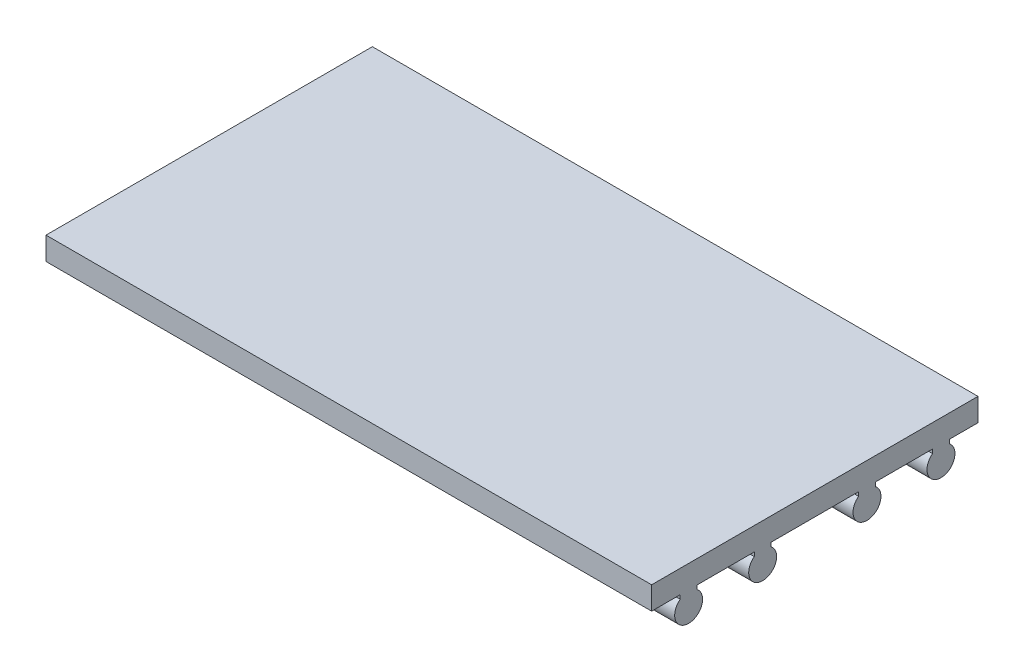
ISO-10303-21;
HEADER;
FILE_DESCRIPTION(('STEP AP214'),'2;1');
FILE_NAME('part.step','',(''),(''),'','','');
FILE_SCHEMA(('AUTOMOTIVE_DESIGN { 1 0 10303 214 1 1 1 1 }'));
ENDSEC;
DATA;
#1=APPLICATION_CONTEXT('core data for automotive mechanical design processes');
#2=APPLICATION_PROTOCOL_DEFINITION('international standard','automotive_design',2000,#1);
#3=PRODUCT_CONTEXT('',#1,'mechanical');
#4=PRODUCT('Part','Part','',(#3));
#5=PRODUCT_RELATED_PRODUCT_CATEGORY('part','',(#4));
#6=PRODUCT_DEFINITION_FORMATION('','',#4);
#7=PRODUCT_DEFINITION_CONTEXT('part definition',#1,'design');
#8=PRODUCT_DEFINITION('design','',#6,#7);
#9=PRODUCT_DEFINITION_SHAPE('','',#8);
#10=(LENGTH_UNIT() NAMED_UNIT(*) SI_UNIT(.MILLI.,.METRE.));
#11=(NAMED_UNIT(*) PLANE_ANGLE_UNIT() SI_UNIT($,.RADIAN.));
#12=(NAMED_UNIT(*) SI_UNIT($,.STERADIAN.) SOLID_ANGLE_UNIT());
#13=UNCERTAINTY_MEASURE_WITH_UNIT(LENGTH_MEASURE(1.E-05),#10,'distance_accuracy_value','');
#14=(GEOMETRIC_REPRESENTATION_CONTEXT(3) GLOBAL_UNCERTAINTY_ASSIGNED_CONTEXT((#13)) GLOBAL_UNIT_ASSIGNED_CONTEXT((#10,
#11,#12)) REPRESENTATION_CONTEXT('',''));
#15=CARTESIAN_POINT('',(0.,0.,0.));
#16=DIRECTION('',(0.,0.,1.));
#17=DIRECTION('',(1.,0.,0.));
#18=AXIS2_PLACEMENT_3D('',#15,#16,#17);
#19=CARTESIAN_POINT('',(90.,224.250000000007,-5.50000000000004));
#20=DIRECTION('',(1.,0.,0.));
#21=DIRECTION('',(0.,0.,-1.));
#22=AXIS2_PLACEMENT_3D('',#19,#20,#21);
#23=PLANE('',#22);
#24=DIRECTION('',(0.,1.,0.));
#25=VECTOR('',#24,1.);
#26=CARTESIAN_POINT('',(90.,226.5,-11.));
#27=LINE('',#26,#25);
#28=CARTESIAN_POINT('',(90.,226.5,-11.));
#29=VERTEX_POINT('',#28);
#30=CARTESIAN_POINT('',(90.,229.900000000001,-11.));
#31=VERTEX_POINT('',#30);
#32=EDGE_CURVE('E317',#29,#31,#27,.T.);
#33=ORIENTED_EDGE('',*,*,#32,.T.);
#34=DIRECTION('',(0.,0.,-1.));
#35=VECTOR('',#34,1.);
#36=CARTESIAN_POINT('',(90.,229.900000000001,37.4999999999997));
#37=LINE('',#36,#35);
#38=CARTESIAN_POINT('',(90.,229.900000000001,37.4999999999997));
#39=VERTEX_POINT('',#38);
#40=EDGE_CURVE('E306',#39,#31,#37,.T.);
#41=ORIENTED_EDGE('',*,*,#40,.F.);
#42=DIRECTION('',(0.,-1.,0.));
#43=VECTOR('',#42,1.);
#44=CARTESIAN_POINT('',(90.,230.750000000007,37.4999999999997));
#45=LINE('',#44,#43);
#46=CARTESIAN_POINT('',(90.,226.500000000007,37.4999999999997));
#47=VERTEX_POINT('',#46);
#48=EDGE_CURVE('E199',#39,#47,#45,.T.);
#49=ORIENTED_EDGE('',*,*,#48,.T.);
#50=DIRECTION('',(0.,0.,-1.));
#51=VECTOR('',#50,1.);
#52=CARTESIAN_POINT('',(90.,226.500000000007,37.4999999999997));
#53=LINE('',#52,#51);
#54=CARTESIAN_POINT('',(90.,226.500000000007,33.2499999999997));
#55=VERTEX_POINT('',#54);
#56=EDGE_CURVE('E201',#47,#55,#53,.T.);
#57=ORIENTED_EDGE('',*,*,#56,.T.);
#58=DIRECTION('',(0.,-1.,0.));
#59=VECTOR('',#58,1.);
#60=CARTESIAN_POINT('',(90.,226.500000000007,33.2499999999997));
#61=LINE('',#60,#59);
#62=CARTESIAN_POINT('',(90.,225.906238207512,33.2499999999997));
#63=VERTEX_POINT('',#62);
#64=EDGE_CURVE('E204',#55,#63,#61,.T.);
#65=ORIENTED_EDGE('',*,*,#64,.T.);
#66=CARTESIAN_POINT('',(90.,224.250000000007,31.9999999999999));
#67=DIRECTION('',(1.,0.,0.));
#68=DIRECTION('',(0.,0.,-1.));
#69=AXIS2_PLACEMENT_3D('',#66,#67,#68);
#70=CIRCLE('',#69,2.07499999999999);
#71=CARTESIAN_POINT('',(90.,225.906238207512,30.7500000000001));
#72=VERTEX_POINT('',#71);
#73=EDGE_CURVE('E207',#63,#72,#70,.T.);
#74=ORIENTED_EDGE('',*,*,#73,.T.);
#75=DIRECTION('',(0.,1.,0.));
#76=VECTOR('',#75,1.);
#77=CARTESIAN_POINT('',(90.,225.906238207512,30.7500000000001));
#78=LINE('',#77,#76);
#79=CARTESIAN_POINT('',(90.,226.500000000007,30.7500000000001));
#80=VERTEX_POINT('',#79);
#81=EDGE_CURVE('E210',#72,#80,#78,.T.);
#82=ORIENTED_EDGE('',*,*,#81,.T.);
#83=DIRECTION('',(0.,0.,-1.));
#84=VECTOR('',#83,1.);
#85=CARTESIAN_POINT('',(90.,226.500000000007,30.7500000000001));
#86=LINE('',#85,#84);
#87=CARTESIAN_POINT('',(90.,226.500000000007,22.2499999999997));
#88=VERTEX_POINT('',#87);
#89=EDGE_CURVE('E213',#80,#88,#86,.T.);
#90=ORIENTED_EDGE('',*,*,#89,.T.);
#91=DIRECTION('',(0.,-1.,0.));
#92=VECTOR('',#91,1.);
#93=CARTESIAN_POINT('',(90.,226.500000000007,22.2499999999997));
#94=LINE('',#93,#92);
#95=CARTESIAN_POINT('',(90.,225.906238207512,22.2499999999997));
#96=VERTEX_POINT('',#95);
#97=EDGE_CURVE('E216',#88,#96,#94,.T.);
#98=ORIENTED_EDGE('',*,*,#97,.T.);
#99=CARTESIAN_POINT('',(90.,224.250000000007,20.9999999999999));
#100=DIRECTION('',(1.,0.,0.));
#101=DIRECTION('',(0.,0.,-1.));
#102=AXIS2_PLACEMENT_3D('',#99,#100,#101);
#103=CIRCLE('',#102,2.07499999999999);
#104=CARTESIAN_POINT('',(90.,225.906238207512,19.7500000000001));
#105=VERTEX_POINT('',#104);
#106=EDGE_CURVE('E219',#96,#105,#103,.T.);
#107=ORIENTED_EDGE('',*,*,#106,.T.);
#108=DIRECTION('',(0.,1.,0.));
#109=VECTOR('',#108,1.);
#110=CARTESIAN_POINT('',(90.,225.906238207512,19.7500000000001));
#111=LINE('',#110,#109);
#112=CARTESIAN_POINT('',(90.,226.500000000007,19.7500000000001));
#113=VERTEX_POINT('',#112);
#114=EDGE_CURVE('E222',#105,#113,#111,.T.);
#115=ORIENTED_EDGE('',*,*,#114,.T.);
#116=DIRECTION('',(0.,0.,-1.));
#117=VECTOR('',#116,1.);
#118=CARTESIAN_POINT('',(90.,226.500000000007,19.7500000000001));
#119=LINE('',#118,#117);
#120=CARTESIAN_POINT('',(90.,226.500000000007,6.75));
#121=VERTEX_POINT('',#120);
#122=EDGE_CURVE('E225',#113,#121,#119,.T.);
#123=ORIENTED_EDGE('',*,*,#122,.T.);
#124=DIRECTION('',(0.,-1.,0.));
#125=VECTOR('',#124,1.);
#126=CARTESIAN_POINT('',(90.,226.500000000007,6.75));
#127=LINE('',#126,#125);
#128=CARTESIAN_POINT('',(90.,225.906238207512,6.75));
#129=VERTEX_POINT('',#128);
#130=EDGE_CURVE('E228',#121,#129,#127,.T.);
#131=ORIENTED_EDGE('',*,*,#130,.T.);
#132=CARTESIAN_POINT('',(90.,224.250000000007,5.49999999999995));
#133=DIRECTION('',(1.,0.,0.));
#134=DIRECTION('',(0.,0.,-1.));
#135=AXIS2_PLACEMENT_3D('',#132,#133,#134);
#136=CIRCLE('',#135,2.075);
#137=CARTESIAN_POINT('',(90.,225.906238207512,4.24999999999991));
#138=VERTEX_POINT('',#137);
#139=EDGE_CURVE('E231',#129,#138,#136,.T.);
#140=ORIENTED_EDGE('',*,*,#139,.T.);
#141=DIRECTION('',(0.,1.,0.));
#142=VECTOR('',#141,1.);
#143=CARTESIAN_POINT('',(90.,225.906238207512,4.24999999999991));
#144=LINE('',#143,#142);
#145=CARTESIAN_POINT('',(90.,226.500000000007,4.24999999999991));
#146=VERTEX_POINT('',#145);
#147=EDGE_CURVE('E234',#138,#146,#144,.T.);
#148=ORIENTED_EDGE('',*,*,#147,.T.);
#149=DIRECTION('',(0.,0.,-1.));
#150=VECTOR('',#149,1.);
#151=CARTESIAN_POINT('',(90.,226.500000000007,4.24999999999991));
#152=LINE('',#151,#150);
#153=CARTESIAN_POINT('',(90.,226.500000000007,-4.24999999999999));
#154=VERTEX_POINT('',#153);
#155=EDGE_CURVE('E167',#146,#154,#152,.T.);
#156=ORIENTED_EDGE('',*,*,#155,.T.);
#157=DIRECTION('',(0.,-1.,0.));
#158=VECTOR('',#157,1.);
#159=CARTESIAN_POINT('',(90.,226.500000000007,-4.24999999999999));
#160=LINE('',#159,#158);
#161=CARTESIAN_POINT('',(90.,225.906238207512,-4.24999999999999));
#162=VERTEX_POINT('',#161);
#163=EDGE_CURVE('E237',#154,#162,#160,.T.);
#164=ORIENTED_EDGE('',*,*,#163,.T.);
#165=CARTESIAN_POINT('',(90.,224.250000000007,-5.50000000000004));
#166=DIRECTION('',(1.,0.,0.));
#167=DIRECTION('',(0.,0.,-1.));
#168=AXIS2_PLACEMENT_3D('',#165,#166,#167);
#169=CIRCLE('',#168,2.075);
#170=CARTESIAN_POINT('',(90.,225.906238207512,-6.75000000000008));
#171=VERTEX_POINT('',#170);
#172=EDGE_CURVE('E192',#162,#171,#169,.T.);
#173=ORIENTED_EDGE('',*,*,#172,.T.);
#174=DIRECTION('',(0.,1.,0.));
#175=VECTOR('',#174,1.);
#176=CARTESIAN_POINT('',(90.,225.906238207512,-6.75000000000008));
#177=LINE('',#176,#175);
#178=CARTESIAN_POINT('',(90.,226.5,-6.75000000000076));
#179=VERTEX_POINT('',#178);
#180=EDGE_CURVE('E195',#171,#179,#177,.T.);
#181=ORIENTED_EDGE('',*,*,#180,.T.);
#182=DIRECTION('',(0.,0.,1.));
#183=VECTOR('',#182,1.);
#184=CARTESIAN_POINT('',(90.,226.5,-14.9500000000008));
#185=LINE('',#184,#183);
#186=EDGE_CURVE('E323',#29,#179,#185,.T.);
#187=ORIENTED_EDGE('',*,*,#186,.F.);
#188=EDGE_LOOP('',(#33,#41,#49,#57,#65,#74,#82,#90,#98,#107,#115,#123,#131,#140,#148,#156,#164,
#173,#181,#187));
#189=FACE_BOUND('',#188,.T.);
#190=ADVANCED_FACE('F33',(#189),#23,.T.);
#191=CARTESIAN_POINT('',(0.,224.250000000007,-5.50000000000004));
#192=DIRECTION('',(1.,0.,0.));
#193=DIRECTION('',(0.,0.,-1.));
#194=AXIS2_PLACEMENT_3D('',#191,#192,#193);
#195=PLANE('',#194);
#196=DIRECTION('',(0.,0.,1.));
#197=VECTOR('',#196,1.);
#198=CARTESIAN_POINT('',(0.,229.900000000001,-11.3636931828054));
#199=LINE('',#198,#197);
#200=CARTESIAN_POINT('',(0.,229.900000000001,-11.));
#201=VERTEX_POINT('',#200);
#202=CARTESIAN_POINT('',(0.,229.900000000001,37.4999999999997));
#203=VERTEX_POINT('',#202);
#204=EDGE_CURVE('E312',#201,#203,#199,.T.);
#205=ORIENTED_EDGE('',*,*,#204,.F.);
#206=DIRECTION('',(0.,1.,0.));
#207=VECTOR('',#206,1.);
#208=CARTESIAN_POINT('',(0.,226.5,-11.));
#209=LINE('',#208,#207);
#210=CARTESIAN_POINT('',(0.,226.5,-11.));
#211=VERTEX_POINT('',#210);
#212=EDGE_CURVE('E48',#211,#201,#209,.T.);
#213=ORIENTED_EDGE('',*,*,#212,.F.);
#214=DIRECTION('',(0.,0.,1.));
#215=VECTOR('',#214,1.);
#216=CARTESIAN_POINT('',(0.,226.5,-14.9500000000008));
#217=LINE('',#216,#215);
#218=CARTESIAN_POINT('',(0.,226.5,-6.75000000000076));
#219=VERTEX_POINT('',#218);
#220=EDGE_CURVE('E196',#211,#219,#217,.T.);
#221=ORIENTED_EDGE('',*,*,#220,.T.);
#222=DIRECTION('',(0.,1.,0.));
#223=VECTOR('',#222,1.);
#224=CARTESIAN_POINT('',(0.,225.906238207512,-6.75000000000008));
#225=LINE('',#224,#223);
#226=CARTESIAN_POINT('',(0.,225.906238207512,-6.75000000000008));
#227=VERTEX_POINT('',#226);
#228=EDGE_CURVE('E329',#227,#219,#225,.T.);
#229=ORIENTED_EDGE('',*,*,#228,.F.);
#230=CARTESIAN_POINT('',(0.,224.250000000007,-5.50000000000004));
#231=DIRECTION('',(1.,0.,0.));
#232=DIRECTION('',(0.,0.,-1.));
#233=AXIS2_PLACEMENT_3D('',#230,#231,#232);
#234=CIRCLE('',#233,2.075);
#235=CARTESIAN_POINT('',(0.,225.906238207512,-4.24999999999999));
#236=VERTEX_POINT('',#235);
#237=EDGE_CURVE('E240',#236,#227,#234,.T.);
#238=ORIENTED_EDGE('',*,*,#237,.F.);
#239=DIRECTION('',(0.,-1.,0.));
#240=VECTOR('',#239,1.);
#241=CARTESIAN_POINT('',(0.,226.500000000007,-4.24999999999999));
#242=LINE('',#241,#240);
#243=CARTESIAN_POINT('',(0.,226.500000000007,-4.24999999999999));
#244=VERTEX_POINT('',#243);
#245=EDGE_CURVE('E182',#244,#236,#242,.T.);
#246=ORIENTED_EDGE('',*,*,#245,.F.);
#247=DIRECTION('',(0.,0.,-1.));
#248=VECTOR('',#247,1.);
#249=CARTESIAN_POINT('',(0.,226.500000000007,4.24999999999991));
#250=LINE('',#249,#248);
#251=CARTESIAN_POINT('',(0.,226.500000000007,4.24999999999991));
#252=VERTEX_POINT('',#251);
#253=EDGE_CURVE('E164',#252,#244,#250,.T.);
#254=ORIENTED_EDGE('',*,*,#253,.F.);
#255=DIRECTION('',(0.,1.,0.));
#256=VECTOR('',#255,1.);
#257=CARTESIAN_POINT('',(0.,225.906238207512,4.24999999999991));
#258=LINE('',#257,#256);
#259=CARTESIAN_POINT('',(0.,225.906238207512,4.24999999999991));
#260=VERTEX_POINT('',#259);
#261=EDGE_CURVE('E180',#260,#252,#258,.T.);
#262=ORIENTED_EDGE('',*,*,#261,.F.);
#263=CARTESIAN_POINT('',(0.,224.250000000007,5.49999999999995));
#264=DIRECTION('',(1.,0.,0.));
#265=DIRECTION('',(0.,0.,-1.));
#266=AXIS2_PLACEMENT_3D('',#263,#264,#265);
#267=CIRCLE('',#266,2.075);
#268=CARTESIAN_POINT('',(0.,225.906238207512,6.75));
#269=VERTEX_POINT('',#268);
#270=EDGE_CURVE('E185',#269,#260,#267,.T.);
#271=ORIENTED_EDGE('',*,*,#270,.F.);
#272=DIRECTION('',(0.,-1.,0.));
#273=VECTOR('',#272,1.);
#274=CARTESIAN_POINT('',(0.,226.500000000007,6.75));
#275=LINE('',#274,#273);
#276=CARTESIAN_POINT('',(0.,226.500000000007,6.75));
#277=VERTEX_POINT('',#276);
#278=EDGE_CURVE('E187',#277,#269,#275,.T.);
#279=ORIENTED_EDGE('',*,*,#278,.F.);
#280=DIRECTION('',(0.,0.,-1.));
#281=VECTOR('',#280,1.);
#282=CARTESIAN_POINT('',(0.,226.500000000007,19.7500000000001));
#283=LINE('',#282,#281);
#284=CARTESIAN_POINT('',(0.,226.500000000007,19.7500000000001));
#285=VERTEX_POINT('',#284);
#286=EDGE_CURVE('E357',#285,#277,#283,.T.);
#287=ORIENTED_EDGE('',*,*,#286,.F.);
#288=DIRECTION('',(0.,1.,0.));
#289=VECTOR('',#288,1.);
#290=CARTESIAN_POINT('',(0.,225.906238207512,19.7500000000001));
#291=LINE('',#290,#289);
#292=CARTESIAN_POINT('',(0.,225.906238207512,19.7500000000001));
#293=VERTEX_POINT('',#292);
#294=EDGE_CURVE('E354',#293,#285,#291,.T.);
#295=ORIENTED_EDGE('',*,*,#294,.F.);
#296=CARTESIAN_POINT('',(0.,224.250000000007,20.9999999999999));
#297=DIRECTION('',(1.,0.,0.));
#298=DIRECTION('',(0.,0.,-1.));
#299=AXIS2_PLACEMENT_3D('',#296,#297,#298);
#300=CIRCLE('',#299,2.07499999999999);
#301=CARTESIAN_POINT('',(0.,225.906238207512,22.2499999999997));
#302=VERTEX_POINT('',#301);
#303=EDGE_CURVE('E351',#302,#293,#300,.T.);
#304=ORIENTED_EDGE('',*,*,#303,.F.);
#305=DIRECTION('',(0.,-1.,0.));
#306=VECTOR('',#305,1.);
#307=CARTESIAN_POINT('',(0.,226.500000000007,22.2499999999997));
#308=LINE('',#307,#306);
#309=CARTESIAN_POINT('',(0.,226.500000000007,22.2499999999997));
#310=VERTEX_POINT('',#309);
#311=EDGE_CURVE('E348',#310,#302,#308,.T.);
#312=ORIENTED_EDGE('',*,*,#311,.F.);
#313=DIRECTION('',(0.,0.,-1.));
#314=VECTOR('',#313,1.);
#315=CARTESIAN_POINT('',(0.,226.500000000007,30.7500000000001));
#316=LINE('',#315,#314);
#317=CARTESIAN_POINT('',(0.,226.500000000007,30.7500000000001));
#318=VERTEX_POINT('',#317);
#319=EDGE_CURVE('E345',#318,#310,#316,.T.);
#320=ORIENTED_EDGE('',*,*,#319,.F.);
#321=DIRECTION('',(0.,1.,0.));
#322=VECTOR('',#321,1.);
#323=CARTESIAN_POINT('',(0.,225.906238207512,30.7500000000001));
#324=LINE('',#323,#322);
#325=CARTESIAN_POINT('',(0.,225.906238207512,30.7500000000001));
#326=VERTEX_POINT('',#325);
#327=EDGE_CURVE('E342',#326,#318,#324,.T.);
#328=ORIENTED_EDGE('',*,*,#327,.F.);
#329=CARTESIAN_POINT('',(0.,224.250000000007,31.9999999999999));
#330=DIRECTION('',(1.,0.,0.));
#331=DIRECTION('',(0.,0.,-1.));
#332=AXIS2_PLACEMENT_3D('',#329,#330,#331);
#333=CIRCLE('',#332,2.07499999999999);
#334=CARTESIAN_POINT('',(0.,225.906238207512,33.2499999999997));
#335=VERTEX_POINT('',#334);
#336=EDGE_CURVE('E339',#335,#326,#333,.T.);
#337=ORIENTED_EDGE('',*,*,#336,.F.);
#338=DIRECTION('',(0.,-1.,0.));
#339=VECTOR('',#338,1.);
#340=CARTESIAN_POINT('',(0.,226.500000000007,33.2499999999997));
#341=LINE('',#340,#339);
#342=CARTESIAN_POINT('',(0.,226.500000000007,33.2499999999997));
#343=VERTEX_POINT('',#342);
#344=EDGE_CURVE('E336',#343,#335,#341,.T.);
#345=ORIENTED_EDGE('',*,*,#344,.F.);
#346=DIRECTION('',(0.,0.,-1.));
#347=VECTOR('',#346,1.);
#348=CARTESIAN_POINT('',(0.,226.500000000007,37.4999999999997));
#349=LINE('',#348,#347);
#350=CARTESIAN_POINT('',(0.,226.500000000007,37.4999999999997));
#351=VERTEX_POINT('',#350);
#352=EDGE_CURVE('E333',#351,#343,#349,.T.);
#353=ORIENTED_EDGE('',*,*,#352,.F.);
#354=DIRECTION('',(0.,-1.,0.));
#355=VECTOR('',#354,1.);
#356=CARTESIAN_POINT('',(0.,230.750000000007,37.4999999999997));
#357=LINE('',#356,#355);
#358=EDGE_CURVE('E331',#203,#351,#357,.T.);
#359=ORIENTED_EDGE('',*,*,#358,.F.);
#360=EDGE_LOOP('',(#205,#213,#221,#229,#238,#246,#254,#262,#271,#279,#287,#295,#304,#312,#320,
#328,#337,#345,#353,#359));
#361=FACE_BOUND('',#360,.T.);
#362=ADVANCED_FACE('F178',(#361),#195,.F.);
#363=CARTESIAN_POINT('',(0.,229.900000000001,0.));
#364=DIRECTION('',(0.,1.,0.));
#365=DIRECTION('',(0.,0.,1.));
#366=AXIS2_PLACEMENT_3D('',#363,#364,#365);
#367=PLANE('',#366);
#368=ORIENTED_EDGE('',*,*,#40,.T.);
#369=DIRECTION('',(-1.,0.,0.));
#370=VECTOR('',#369,1.);
#371=CARTESIAN_POINT('',(0.,229.900000000001,-11.));
#372=LINE('',#371,#370);
#373=EDGE_CURVE('E11',#31,#201,#372,.T.);
#374=ORIENTED_EDGE('',*,*,#373,.T.);
#375=ORIENTED_EDGE('',*,*,#204,.T.);
#376=DIRECTION('',(1.,0.,0.));
#377=VECTOR('',#376,1.);
#378=CARTESIAN_POINT('',(0.,229.900000000001,37.4999999999997));
#379=LINE('',#378,#377);
#380=EDGE_CURVE('E310',#203,#39,#379,.T.);
#381=ORIENTED_EDGE('',*,*,#380,.T.);
#382=EDGE_LOOP('',(#368,#374,#375,#381));
#383=FACE_BOUND('',#382,.T.);
#384=ADVANCED_FACE('F286',(#383),#367,.T.);
#385=CARTESIAN_POINT('',(0.,225.906238207512,-6.75000000000008));
#386=DIRECTION('',(0.,0.,-1.));
#387=DIRECTION('',(-1.,0.,0.));
#388=AXIS2_PLACEMENT_3D('',#385,#386,#387);
#389=PLANE('',#388);
#390=ORIENTED_EDGE('',*,*,#228,.T.);
#391=DIRECTION('',(-1.,0.,0.));
#392=VECTOR('',#391,1.);
#393=CARTESIAN_POINT('',(0.,226.5,-6.75000000000076));
#394=LINE('',#393,#392);
#395=EDGE_CURVE('E269',#179,#219,#394,.T.);
#396=ORIENTED_EDGE('',*,*,#395,.F.);
#397=ORIENTED_EDGE('',*,*,#180,.F.);
#398=DIRECTION('',(1.,0.,0.));
#399=VECTOR('',#398,1.);
#400=CARTESIAN_POINT('',(0.,225.906238207512,-6.75000000000008));
#401=LINE('',#400,#399);
#402=EDGE_CURVE('E118',#227,#171,#401,.T.);
#403=ORIENTED_EDGE('',*,*,#402,.F.);
#404=EDGE_LOOP('',(#390,#396,#397,#403));
#405=FACE_BOUND('',#404,.T.);
#406=ADVANCED_FACE('F267',(#405),#389,.T.);
#407=CARTESIAN_POINT('',(0.,224.250000000007,-5.50000000000004));
#408=DIRECTION('',(1.,0.,0.));
#409=DIRECTION('',(0.,0.,-1.));
#410=AXIS2_PLACEMENT_3D('',#407,#408,#409);
#411=CYLINDRICAL_SURFACE('',#410,2.075);
#412=ORIENTED_EDGE('',*,*,#172,.F.);
#413=DIRECTION('',(1.,0.,0.));
#414=VECTOR('',#413,1.);
#415=CARTESIAN_POINT('',(0.,225.906238207512,-4.24999999999999));
#416=LINE('',#415,#414);
#417=EDGE_CURVE('E41',#236,#162,#416,.T.);
#418=ORIENTED_EDGE('',*,*,#417,.F.);
#419=ORIENTED_EDGE('',*,*,#237,.T.);
#420=ORIENTED_EDGE('',*,*,#402,.T.);
#421=EDGE_LOOP('',(#412,#418,#419,#420));
#422=FACE_BOUND('',#421,.T.);
#423=ADVANCED_FACE('F35',(#422),#411,.T.);
#424=CARTESIAN_POINT('',(0.,226.500000000007,-4.24999999999999));
#425=DIRECTION('',(0.,0.,1.));
#426=DIRECTION('',(1.,0.,0.));
#427=AXIS2_PLACEMENT_3D('',#424,#425,#426);
#428=PLANE('',#427);
#429=ORIENTED_EDGE('',*,*,#163,.F.);
#430=DIRECTION('',(1.,0.,0.));
#431=VECTOR('',#430,1.);
#432=CARTESIAN_POINT('',(0.,226.500000000007,-4.24999999999999));
#433=LINE('',#432,#431);
#434=EDGE_CURVE('E172',#244,#154,#433,.T.);
#435=ORIENTED_EDGE('',*,*,#434,.F.);
#436=ORIENTED_EDGE('',*,*,#245,.T.);
#437=ORIENTED_EDGE('',*,*,#417,.T.);
#438=EDGE_LOOP('',(#429,#435,#436,#437));
#439=FACE_BOUND('',#438,.T.);
#440=ADVANCED_FACE('F273',(#439),#428,.T.);
#441=CARTESIAN_POINT('',(0.,226.500000000007,4.24999999999991));
#442=DIRECTION('',(0.,-1.,0.));
#443=DIRECTION('',(0.,0.,-1.));
#444=AXIS2_PLACEMENT_3D('',#441,#442,#443);
#445=PLANE('',#444);
#446=ORIENTED_EDGE('',*,*,#155,.F.);
#447=DIRECTION('',(1.,0.,0.));
#448=VECTOR('',#447,1.);
#449=CARTESIAN_POINT('',(0.,226.500000000007,4.24999999999991));
#450=LINE('',#449,#448);
#451=EDGE_CURVE('E161',#252,#146,#450,.T.);
#452=ORIENTED_EDGE('',*,*,#451,.F.);
#453=ORIENTED_EDGE('',*,*,#253,.T.);
#454=ORIENTED_EDGE('',*,*,#434,.T.);
#455=EDGE_LOOP('',(#446,#452,#453,#454));
#456=FACE_BOUND('',#455,.T.);
#457=ADVANCED_FACE('F163',(#456),#445,.T.);
#458=CARTESIAN_POINT('',(0.,225.906238207512,4.24999999999991));
#459=DIRECTION('',(0.,0.,-1.));
#460=DIRECTION('',(-1.,0.,0.));
#461=AXIS2_PLACEMENT_3D('',#458,#459,#460);
#462=PLANE('',#461);
#463=ORIENTED_EDGE('',*,*,#147,.F.);
#464=DIRECTION('',(1.,0.,0.));
#465=VECTOR('',#464,1.);
#466=CARTESIAN_POINT('',(0.,225.906238207512,4.24999999999991));
#467=LINE('',#466,#465);
#468=EDGE_CURVE('E173',#260,#138,#467,.T.);
#469=ORIENTED_EDGE('',*,*,#468,.F.);
#470=ORIENTED_EDGE('',*,*,#261,.T.);
#471=ORIENTED_EDGE('',*,*,#451,.T.);
#472=EDGE_LOOP('',(#463,#469,#470,#471));
#473=FACE_BOUND('',#472,.T.);
#474=ADVANCED_FACE('F184',(#473),#462,.T.);
#475=CARTESIAN_POINT('',(0.,224.250000000007,5.49999999999995));
#476=DIRECTION('',(1.,0.,0.));
#477=DIRECTION('',(0.,0.,-1.));
#478=AXIS2_PLACEMENT_3D('',#475,#476,#477);
#479=CYLINDRICAL_SURFACE('',#478,2.075);
#480=ORIENTED_EDGE('',*,*,#139,.F.);
#481=DIRECTION('',(1.,0.,0.));
#482=VECTOR('',#481,1.);
#483=CARTESIAN_POINT('',(0.,225.906238207512,6.75));
#484=LINE('',#483,#482);
#485=EDGE_CURVE('E244',#269,#129,#484,.T.);
#486=ORIENTED_EDGE('',*,*,#485,.F.);
#487=ORIENTED_EDGE('',*,*,#270,.T.);
#488=ORIENTED_EDGE('',*,*,#468,.T.);
#489=EDGE_LOOP('',(#480,#486,#487,#488));
#490=FACE_BOUND('',#489,.T.);
#491=ADVANCED_FACE('F417',(#490),#479,.T.);
#492=CARTESIAN_POINT('',(0.,226.500000000007,6.75));
#493=DIRECTION('',(0.,0.,1.));
#494=DIRECTION('',(1.,0.,0.));
#495=AXIS2_PLACEMENT_3D('',#492,#493,#494);
#496=PLANE('',#495);
#497=ORIENTED_EDGE('',*,*,#130,.F.);
#498=DIRECTION('',(1.,0.,0.));
#499=VECTOR('',#498,1.);
#500=CARTESIAN_POINT('',(0.,226.500000000007,6.75));
#501=LINE('',#500,#499);
#502=EDGE_CURVE('E246',#277,#121,#501,.T.);
#503=ORIENTED_EDGE('',*,*,#502,.F.);
#504=ORIENTED_EDGE('',*,*,#278,.T.);
#505=ORIENTED_EDGE('',*,*,#485,.T.);
#506=EDGE_LOOP('',(#497,#503,#504,#505));
#507=FACE_BOUND('',#506,.T.);
#508=ADVANCED_FACE('F363',(#507),#496,.T.);
#509=CARTESIAN_POINT('',(0.,226.500000000007,19.7500000000001));
#510=DIRECTION('',(0.,-1.,0.));
#511=DIRECTION('',(0.,0.,-1.));
#512=AXIS2_PLACEMENT_3D('',#509,#510,#511);
#513=PLANE('',#512);
#514=ORIENTED_EDGE('',*,*,#122,.F.);
#515=DIRECTION('',(1.,0.,0.));
#516=VECTOR('',#515,1.);
#517=CARTESIAN_POINT('',(0.,226.500000000007,19.7500000000001));
#518=LINE('',#517,#516);
#519=EDGE_CURVE('E248',#285,#113,#518,.T.);
#520=ORIENTED_EDGE('',*,*,#519,.F.);
#521=ORIENTED_EDGE('',*,*,#286,.T.);
#522=ORIENTED_EDGE('',*,*,#502,.T.);
#523=EDGE_LOOP('',(#514,#520,#521,#522));
#524=FACE_BOUND('',#523,.T.);
#525=ADVANCED_FACE('F369',(#524),#513,.T.);
#526=CARTESIAN_POINT('',(0.,225.906238207512,19.7500000000001));
#527=DIRECTION('',(0.,0.,-1.));
#528=DIRECTION('',(-1.,0.,0.));
#529=AXIS2_PLACEMENT_3D('',#526,#527,#528);
#530=PLANE('',#529);
#531=ORIENTED_EDGE('',*,*,#114,.F.);
#532=DIRECTION('',(1.,0.,0.));
#533=VECTOR('',#532,1.);
#534=CARTESIAN_POINT('',(0.,225.906238207512,19.7500000000001));
#535=LINE('',#534,#533);
#536=EDGE_CURVE('E250',#293,#105,#535,.T.);
#537=ORIENTED_EDGE('',*,*,#536,.F.);
#538=ORIENTED_EDGE('',*,*,#294,.T.);
#539=ORIENTED_EDGE('',*,*,#519,.T.);
#540=EDGE_LOOP('',(#531,#537,#538,#539));
#541=FACE_BOUND('',#540,.T.);
#542=ADVANCED_FACE('F372',(#541),#530,.T.);
#543=CARTESIAN_POINT('',(0.,224.250000000007,20.9999999999999));
#544=DIRECTION('',(1.,0.,0.));
#545=DIRECTION('',(0.,0.,-1.));
#546=AXIS2_PLACEMENT_3D('',#543,#544,#545);
#547=CYLINDRICAL_SURFACE('',#546,2.07499999999999);
#548=ORIENTED_EDGE('',*,*,#106,.F.);
#549=DIRECTION('',(1.,0.,0.));
#550=VECTOR('',#549,1.);
#551=CARTESIAN_POINT('',(0.,225.906238207512,22.2499999999997));
#552=LINE('',#551,#550);
#553=EDGE_CURVE('E252',#302,#96,#552,.T.);
#554=ORIENTED_EDGE('',*,*,#553,.F.);
#555=ORIENTED_EDGE('',*,*,#303,.T.);
#556=ORIENTED_EDGE('',*,*,#536,.T.);
#557=EDGE_LOOP('',(#548,#554,#555,#556));
#558=FACE_BOUND('',#557,.T.);
#559=ADVANCED_FACE('F377',(#558),#547,.T.);
#560=CARTESIAN_POINT('',(0.,226.500000000007,22.2499999999997));
#561=DIRECTION('',(0.,0.,1.));
#562=DIRECTION('',(1.,0.,0.));
#563=AXIS2_PLACEMENT_3D('',#560,#561,#562);
#564=PLANE('',#563);
#565=ORIENTED_EDGE('',*,*,#97,.F.);
#566=DIRECTION('',(1.,0.,0.));
#567=VECTOR('',#566,1.);
#568=CARTESIAN_POINT('',(0.,226.500000000007,22.2499999999997));
#569=LINE('',#568,#567);
#570=EDGE_CURVE('E254',#310,#88,#569,.T.);
#571=ORIENTED_EDGE('',*,*,#570,.F.);
#572=ORIENTED_EDGE('',*,*,#311,.T.);
#573=ORIENTED_EDGE('',*,*,#553,.T.);
#574=EDGE_LOOP('',(#565,#571,#572,#573));
#575=FACE_BOUND('',#574,.T.);
#576=ADVANCED_FACE('F380',(#575),#564,.T.);
#577=CARTESIAN_POINT('',(0.,226.500000000007,30.7500000000001));
#578=DIRECTION('',(0.,-1.,0.));
#579=DIRECTION('',(0.,0.,-1.));
#580=AXIS2_PLACEMENT_3D('',#577,#578,#579);
#581=PLANE('',#580);
#582=ORIENTED_EDGE('',*,*,#89,.F.);
#583=DIRECTION('',(1.,0.,0.));
#584=VECTOR('',#583,1.);
#585=CARTESIAN_POINT('',(0.,226.500000000007,30.7500000000001));
#586=LINE('',#585,#584);
#587=EDGE_CURVE('E256',#318,#80,#586,.T.);
#588=ORIENTED_EDGE('',*,*,#587,.F.);
#589=ORIENTED_EDGE('',*,*,#319,.T.);
#590=ORIENTED_EDGE('',*,*,#570,.T.);
#591=EDGE_LOOP('',(#582,#588,#589,#590));
#592=FACE_BOUND('',#591,.T.);
#593=ADVANCED_FACE('F385',(#592),#581,.T.);
#594=CARTESIAN_POINT('',(0.,225.906238207512,30.7500000000001));
#595=DIRECTION('',(0.,0.,-1.));
#596=DIRECTION('',(-1.,0.,0.));
#597=AXIS2_PLACEMENT_3D('',#594,#595,#596);
#598=PLANE('',#597);
#599=ORIENTED_EDGE('',*,*,#81,.F.);
#600=DIRECTION('',(1.,0.,0.));
#601=VECTOR('',#600,1.);
#602=CARTESIAN_POINT('',(0.,225.906238207512,30.7500000000001));
#603=LINE('',#602,#601);
#604=EDGE_CURVE('E258',#326,#72,#603,.T.);
#605=ORIENTED_EDGE('',*,*,#604,.F.);
#606=ORIENTED_EDGE('',*,*,#327,.T.);
#607=ORIENTED_EDGE('',*,*,#587,.T.);
#608=EDGE_LOOP('',(#599,#605,#606,#607));
#609=FACE_BOUND('',#608,.T.);
#610=ADVANCED_FACE('F388',(#609),#598,.T.);
#611=CARTESIAN_POINT('',(0.,224.250000000007,31.9999999999999));
#612=DIRECTION('',(1.,0.,0.));
#613=DIRECTION('',(0.,0.,-1.));
#614=AXIS2_PLACEMENT_3D('',#611,#612,#613);
#615=CYLINDRICAL_SURFACE('',#614,2.07499999999999);
#616=ORIENTED_EDGE('',*,*,#73,.F.);
#617=DIRECTION('',(1.,0.,0.));
#618=VECTOR('',#617,1.);
#619=CARTESIAN_POINT('',(0.,225.906238207512,33.2499999999997));
#620=LINE('',#619,#618);
#621=EDGE_CURVE('E260',#335,#63,#620,.T.);
#622=ORIENTED_EDGE('',*,*,#621,.F.);
#623=ORIENTED_EDGE('',*,*,#336,.T.);
#624=ORIENTED_EDGE('',*,*,#604,.T.);
#625=EDGE_LOOP('',(#616,#622,#623,#624));
#626=FACE_BOUND('',#625,.T.);
#627=ADVANCED_FACE('F393',(#626),#615,.T.);
#628=CARTESIAN_POINT('',(0.,226.500000000007,33.2499999999997));
#629=DIRECTION('',(0.,0.,1.));
#630=DIRECTION('',(1.,0.,0.));
#631=AXIS2_PLACEMENT_3D('',#628,#629,#630);
#632=PLANE('',#631);
#633=ORIENTED_EDGE('',*,*,#64,.F.);
#634=DIRECTION('',(1.,0.,0.));
#635=VECTOR('',#634,1.);
#636=CARTESIAN_POINT('',(0.,226.500000000007,33.2499999999997));
#637=LINE('',#636,#635);
#638=EDGE_CURVE('E262',#343,#55,#637,.T.);
#639=ORIENTED_EDGE('',*,*,#638,.F.);
#640=ORIENTED_EDGE('',*,*,#344,.T.);
#641=ORIENTED_EDGE('',*,*,#621,.T.);
#642=EDGE_LOOP('',(#633,#639,#640,#641));
#643=FACE_BOUND('',#642,.T.);
#644=ADVANCED_FACE('F396',(#643),#632,.T.);
#645=CARTESIAN_POINT('',(0.,226.500000000007,37.4999999999997));
#646=DIRECTION('',(0.,-1.,0.));
#647=DIRECTION('',(0.,0.,-1.));
#648=AXIS2_PLACEMENT_3D('',#645,#646,#647);
#649=PLANE('',#648);
#650=ORIENTED_EDGE('',*,*,#56,.F.);
#651=DIRECTION('',(1.,0.,0.));
#652=VECTOR('',#651,1.);
#653=CARTESIAN_POINT('',(0.,226.500000000007,37.4999999999997));
#654=LINE('',#653,#652);
#655=EDGE_CURVE('E264',#351,#47,#654,.T.);
#656=ORIENTED_EDGE('',*,*,#655,.F.);
#657=ORIENTED_EDGE('',*,*,#352,.T.);
#658=ORIENTED_EDGE('',*,*,#638,.T.);
#659=EDGE_LOOP('',(#650,#656,#657,#658));
#660=FACE_BOUND('',#659,.T.);
#661=ADVANCED_FACE('F402',(#660),#649,.T.);
#662=CARTESIAN_POINT('',(0.,230.750000000007,37.4999999999997));
#663=DIRECTION('',(0.,0.,1.));
#664=DIRECTION('',(1.,0.,0.));
#665=AXIS2_PLACEMENT_3D('',#662,#663,#664);
#666=PLANE('',#665);
#667=ORIENTED_EDGE('',*,*,#48,.F.);
#668=ORIENTED_EDGE('',*,*,#380,.F.);
#669=ORIENTED_EDGE('',*,*,#358,.T.);
#670=ORIENTED_EDGE('',*,*,#655,.T.);
#671=EDGE_LOOP('',(#667,#668,#669,#670));
#672=FACE_BOUND('',#671,.T.);
#673=ADVANCED_FACE('F293',(#672),#666,.T.);
#674=CARTESIAN_POINT('',(0.,226.5,-14.9500000000008));
#675=DIRECTION('',(0.,1.,0.));
#676=DIRECTION('',(0.,0.,1.));
#677=AXIS2_PLACEMENT_3D('',#674,#675,#676);
#678=PLANE('',#677);
#679=ORIENTED_EDGE('',*,*,#220,.F.);
#680=DIRECTION('',(-1.,0.,0.));
#681=VECTOR('',#680,1.);
#682=CARTESIAN_POINT('',(90.,226.5,-11.));
#683=LINE('',#682,#681);
#684=EDGE_CURVE('E319',#29,#211,#683,.T.);
#685=ORIENTED_EDGE('',*,*,#684,.F.);
#686=ORIENTED_EDGE('',*,*,#186,.T.);
#687=ORIENTED_EDGE('',*,*,#395,.T.);
#688=EDGE_LOOP('',(#679,#685,#686,#687));
#689=FACE_BOUND('',#688,.T.);
#690=ADVANCED_FACE('F289',(#689),#678,.F.);
#691=CARTESIAN_POINT('',(90.,226.5,-11.));
#692=DIRECTION('',(0.,0.,1.));
#693=DIRECTION('',(1.,0.,0.));
#694=AXIS2_PLACEMENT_3D('',#691,#692,#693);
#695=PLANE('',#694);
#696=ORIENTED_EDGE('',*,*,#212,.T.);
#697=ORIENTED_EDGE('',*,*,#373,.F.);
#698=ORIENTED_EDGE('',*,*,#32,.F.);
#699=ORIENTED_EDGE('',*,*,#684,.T.);
#700=EDGE_LOOP('',(#696,#697,#698,#699));
#701=FACE_BOUND('',#700,.T.);
#702=ADVANCED_FACE('F292',(#701),#695,.F.);
#703=CLOSED_SHELL('',(#190,#362,#384,#406,#423,#440,#457,#474,#491,#508,#525,#542,#559,#576,
#593,#610,#627,#644,#661,#673,#690,#702));
#704=MANIFOLD_SOLID_BREP('B2',#703);
#705=ADVANCED_BREP_SHAPE_REPRESENTATION('',(#18,#704),#14);
#706=SHAPE_DEFINITION_REPRESENTATION(#9,#705);
ENDSEC;
END-ISO-10303-21;
